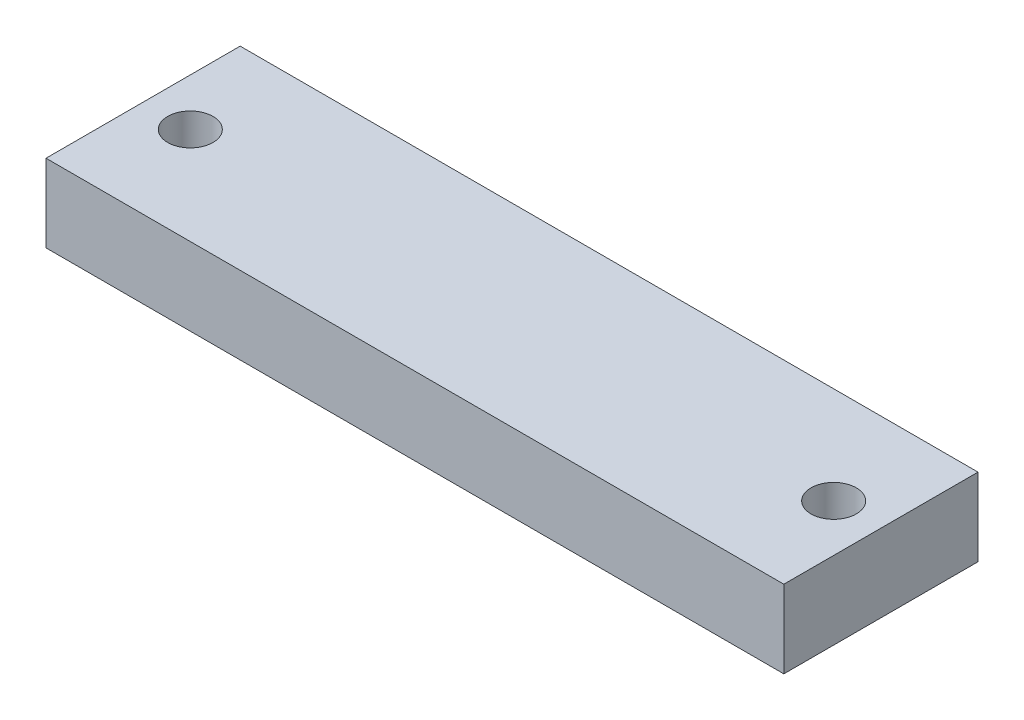
ISO-10303-21;
HEADER;
FILE_DESCRIPTION(('STEP AP214'),'2;1');
FILE_NAME('part.step','',(''),(''),'','','');
FILE_SCHEMA(('AUTOMOTIVE_DESIGN { 1 0 10303 214 1 1 1 1 }'));
ENDSEC;
DATA;
#1=APPLICATION_CONTEXT('core data for automotive mechanical design processes');
#2=APPLICATION_PROTOCOL_DEFINITION('international standard','automotive_design',2000,#1);
#3=PRODUCT_CONTEXT('',#1,'mechanical');
#4=PRODUCT('Part','Part','',(#3));
#5=PRODUCT_RELATED_PRODUCT_CATEGORY('part','',(#4));
#6=PRODUCT_DEFINITION_FORMATION('','',#4);
#7=PRODUCT_DEFINITION_CONTEXT('part definition',#1,'design');
#8=PRODUCT_DEFINITION('design','',#6,#7);
#9=PRODUCT_DEFINITION_SHAPE('','',#8);
#10=(LENGTH_UNIT() NAMED_UNIT(*) SI_UNIT(.MILLI.,.METRE.));
#11=(NAMED_UNIT(*) PLANE_ANGLE_UNIT() SI_UNIT($,.RADIAN.));
#12=(NAMED_UNIT(*) SI_UNIT($,.STERADIAN.) SOLID_ANGLE_UNIT());
#13=UNCERTAINTY_MEASURE_WITH_UNIT(LENGTH_MEASURE(1.E-05),#10,'distance_accuracy_value','');
#14=(GEOMETRIC_REPRESENTATION_CONTEXT(3) GLOBAL_UNCERTAINTY_ASSIGNED_CONTEXT((#13)) GLOBAL_UNIT_ASSIGNED_CONTEXT((#10,
#11,#12)) REPRESENTATION_CONTEXT('',''));
#15=CARTESIAN_POINT('',(0.,0.,0.));
#16=DIRECTION('',(0.,0.,1.));
#17=DIRECTION('',(1.,0.,0.));
#18=AXIS2_PLACEMENT_3D('',#15,#16,#17);
#19=CARTESIAN_POINT('',(0.,6.,0.));
#20=DIRECTION('',(0.,1.,0.));
#21=DIRECTION('',(0.,0.,1.));
#22=AXIS2_PLACEMENT_3D('',#19,#20,#21);
#23=PLANE('',#22);
#24=CARTESIAN_POINT('',(3.65,6.,7.5));
#25=DIRECTION('',(0.,1.,0.));
#26=DIRECTION('',(0.,0.,1.));
#27=AXIS2_PLACEMENT_3D('',#24,#25,#26);
#28=CIRCLE('',#27,1.75);
#29=CARTESIAN_POINT('',(3.65,6.,9.25));
#30=VERTEX_POINT('',#29);
#31=EDGE_CURVE('E119',#30,#30,#28,.T.);
#32=ORIENTED_EDGE('',*,*,#31,.F.);
#33=EDGE_LOOP('',(#32));
#34=FACE_BOUND('',#33,.T.);
#35=DIRECTION('',(0.,0.,1.));
#36=VECTOR('',#35,1.);
#37=CARTESIAN_POINT('',(0.,6.,0.));
#38=LINE('',#37,#36);
#39=CARTESIAN_POINT('',(0.,6.,0.));
#40=VERTEX_POINT('',#39);
#41=CARTESIAN_POINT('',(0.,6.,15.));
#42=VERTEX_POINT('',#41);
#43=EDGE_CURVE('E97',#40,#42,#38,.T.);
#44=ORIENTED_EDGE('',*,*,#43,.T.);
#45=DIRECTION('',(1.,0.,0.));
#46=VECTOR('',#45,1.);
#47=CARTESIAN_POINT('',(0.,6.,15.));
#48=LINE('',#47,#46);
#49=CARTESIAN_POINT('',(57.,6.,15.));
#50=VERTEX_POINT('',#49);
#51=EDGE_CURVE('E93',#42,#50,#48,.T.);
#52=ORIENTED_EDGE('',*,*,#51,.T.);
#53=DIRECTION('',(0.,0.,-1.));
#54=VECTOR('',#53,1.);
#55=CARTESIAN_POINT('',(57.,6.,0.));
#56=LINE('',#55,#54);
#57=CARTESIAN_POINT('',(57.,6.,0.));
#58=VERTEX_POINT('',#57);
#59=EDGE_CURVE('E96',#50,#58,#56,.T.);
#60=ORIENTED_EDGE('',*,*,#59,.T.);
#61=DIRECTION('',(-1.,0.,0.));
#62=VECTOR('',#61,1.);
#63=CARTESIAN_POINT('',(0.,6.,0.));
#64=LINE('',#63,#62);
#65=EDGE_CURVE('E64',#58,#40,#64,.T.);
#66=ORIENTED_EDGE('',*,*,#65,.T.);
#67=EDGE_LOOP('',(#44,#52,#60,#66));
#68=FACE_BOUND('',#67,.T.);
#69=CARTESIAN_POINT('',(53.35,6.,7.5));
#70=DIRECTION('',(0.,1.,0.));
#71=DIRECTION('',(0.,0.,1.));
#72=AXIS2_PLACEMENT_3D('',#69,#70,#71);
#73=CIRCLE('',#72,1.75);
#74=CARTESIAN_POINT('',(53.35,6.,9.25));
#75=VERTEX_POINT('',#74);
#76=EDGE_CURVE('E139',#75,#75,#73,.T.);
#77=ORIENTED_EDGE('',*,*,#76,.F.);
#78=EDGE_LOOP('',(#77));
#79=FACE_BOUND('',#78,.T.);
#80=ADVANCED_FACE('F44',(#34,#68,#79),#23,.T.);
#81=CARTESIAN_POINT('',(0.,0.,0.));
#82=DIRECTION('',(0.,1.,0.));
#83=DIRECTION('',(0.,0.,1.));
#84=AXIS2_PLACEMENT_3D('',#81,#82,#83);
#85=PLANE('',#84);
#86=DIRECTION('',(0.,0.,1.));
#87=VECTOR('',#86,1.);
#88=CARTESIAN_POINT('',(0.,0.,0.));
#89=LINE('',#88,#87);
#90=CARTESIAN_POINT('',(0.,0.,0.));
#91=VERTEX_POINT('',#90);
#92=CARTESIAN_POINT('',(0.,0.,15.));
#93=VERTEX_POINT('',#92);
#94=EDGE_CURVE('E114',#91,#93,#89,.T.);
#95=ORIENTED_EDGE('',*,*,#94,.F.);
#96=DIRECTION('',(-1.,0.,0.));
#97=VECTOR('',#96,1.);
#98=CARTESIAN_POINT('',(0.,0.,0.));
#99=LINE('',#98,#97);
#100=CARTESIAN_POINT('',(57.,0.,0.));
#101=VERTEX_POINT('',#100);
#102=EDGE_CURVE('E86',#101,#91,#99,.T.);
#103=ORIENTED_EDGE('',*,*,#102,.F.);
#104=DIRECTION('',(0.,0.,-1.));
#105=VECTOR('',#104,1.);
#106=CARTESIAN_POINT('',(57.,0.,0.));
#107=LINE('',#106,#105);
#108=CARTESIAN_POINT('',(57.,0.,15.));
#109=VERTEX_POINT('',#108);
#110=EDGE_CURVE('E79',#109,#101,#107,.T.);
#111=ORIENTED_EDGE('',*,*,#110,.F.);
#112=DIRECTION('',(1.,0.,0.));
#113=VECTOR('',#112,1.);
#114=CARTESIAN_POINT('',(0.,0.,15.));
#115=LINE('',#114,#113);
#116=EDGE_CURVE('E104',#93,#109,#115,.T.);
#117=ORIENTED_EDGE('',*,*,#116,.F.);
#118=EDGE_LOOP('',(#95,#103,#111,#117));
#119=FACE_BOUND('',#118,.T.);
#120=CARTESIAN_POINT('',(3.65,0.,7.5));
#121=DIRECTION('',(0.,1.,0.));
#122=DIRECTION('',(0.,0.,1.));
#123=AXIS2_PLACEMENT_3D('',#120,#121,#122);
#124=CIRCLE('',#123,1.75);
#125=CARTESIAN_POINT('',(3.65,0.,9.25));
#126=VERTEX_POINT('',#125);
#127=EDGE_CURVE('E136',#126,#126,#124,.T.);
#128=ORIENTED_EDGE('',*,*,#127,.T.);
#129=EDGE_LOOP('',(#128));
#130=FACE_BOUND('',#129,.T.);
#131=CARTESIAN_POINT('',(53.35,0.,7.5));
#132=DIRECTION('',(0.,1.,0.));
#133=DIRECTION('',(0.,0.,1.));
#134=AXIS2_PLACEMENT_3D('',#131,#132,#133);
#135=CIRCLE('',#134,1.75);
#136=CARTESIAN_POINT('',(53.35,0.,9.25));
#137=VERTEX_POINT('',#136);
#138=EDGE_CURVE('E143',#137,#137,#135,.T.);
#139=ORIENTED_EDGE('',*,*,#138,.T.);
#140=EDGE_LOOP('',(#139));
#141=FACE_BOUND('',#140,.T.);
#142=ADVANCED_FACE('F131',(#119,#130,#141),#85,.F.);
#143=CARTESIAN_POINT('',(0.,6.,0.));
#144=DIRECTION('',(1.,0.,0.));
#145=DIRECTION('',(0.,0.,-1.));
#146=AXIS2_PLACEMENT_3D('',#143,#144,#145);
#147=PLANE('',#146);
#148=ORIENTED_EDGE('',*,*,#94,.T.);
#149=DIRECTION('',(0.,-1.,0.));
#150=VECTOR('',#149,1.);
#151=CARTESIAN_POINT('',(0.,6.,15.));
#152=LINE('',#151,#150);
#153=EDGE_CURVE('E11',#42,#93,#152,.T.);
#154=ORIENTED_EDGE('',*,*,#153,.F.);
#155=ORIENTED_EDGE('',*,*,#43,.F.);
#156=DIRECTION('',(0.,-1.,0.));
#157=VECTOR('',#156,1.);
#158=CARTESIAN_POINT('',(0.,6.,0.));
#159=LINE('',#158,#157);
#160=EDGE_CURVE('E110',#40,#91,#159,.T.);
#161=ORIENTED_EDGE('',*,*,#160,.T.);
#162=EDGE_LOOP('',(#148,#154,#155,#161));
#163=FACE_BOUND('',#162,.T.);
#164=ADVANCED_FACE('F50',(#163),#147,.F.);
#165=CARTESIAN_POINT('',(0.,6.,15.));
#166=DIRECTION('',(0.,0.,-1.));
#167=DIRECTION('',(-1.,0.,0.));
#168=AXIS2_PLACEMENT_3D('',#165,#166,#167);
#169=PLANE('',#168);
#170=ORIENTED_EDGE('',*,*,#116,.T.);
#171=DIRECTION('',(0.,-1.,0.));
#172=VECTOR('',#171,1.);
#173=CARTESIAN_POINT('',(57.,6.,15.));
#174=LINE('',#173,#172);
#175=EDGE_CURVE('E54',#50,#109,#174,.T.);
#176=ORIENTED_EDGE('',*,*,#175,.F.);
#177=ORIENTED_EDGE('',*,*,#51,.F.);
#178=ORIENTED_EDGE('',*,*,#153,.T.);
#179=EDGE_LOOP('',(#170,#176,#177,#178));
#180=FACE_BOUND('',#179,.T.);
#181=ADVANCED_FACE('F105',(#180),#169,.F.);
#182=CARTESIAN_POINT('',(57.,6.,0.));
#183=DIRECTION('',(-1.,0.,0.));
#184=DIRECTION('',(0.,0.,1.));
#185=AXIS2_PLACEMENT_3D('',#182,#183,#184);
#186=PLANE('',#185);
#187=ORIENTED_EDGE('',*,*,#110,.T.);
#188=DIRECTION('',(0.,-1.,0.));
#189=VECTOR('',#188,1.);
#190=CARTESIAN_POINT('',(57.,6.,0.));
#191=LINE('',#190,#189);
#192=EDGE_CURVE('E103',#58,#101,#191,.T.);
#193=ORIENTED_EDGE('',*,*,#192,.F.);
#194=ORIENTED_EDGE('',*,*,#59,.F.);
#195=ORIENTED_EDGE('',*,*,#175,.T.);
#196=EDGE_LOOP('',(#187,#193,#194,#195));
#197=FACE_BOUND('',#196,.T.);
#198=ADVANCED_FACE('F106',(#197),#186,.F.);
#199=CARTESIAN_POINT('',(0.,6.,0.));
#200=DIRECTION('',(0.,0.,1.));
#201=DIRECTION('',(1.,0.,0.));
#202=AXIS2_PLACEMENT_3D('',#199,#200,#201);
#203=PLANE('',#202);
#204=ORIENTED_EDGE('',*,*,#102,.T.);
#205=ORIENTED_EDGE('',*,*,#160,.F.);
#206=ORIENTED_EDGE('',*,*,#65,.F.);
#207=ORIENTED_EDGE('',*,*,#192,.T.);
#208=EDGE_LOOP('',(#204,#205,#206,#207));
#209=FACE_BOUND('',#208,.T.);
#210=ADVANCED_FACE('F126',(#209),#203,.F.);
#211=CARTESIAN_POINT('',(3.65,6.,7.5));
#212=DIRECTION('',(0.,-1.,0.));
#213=DIRECTION('',(0.,0.,-1.));
#214=AXIS2_PLACEMENT_3D('',#211,#212,#213);
#215=CYLINDRICAL_SURFACE('',#214,1.75);
#216=ORIENTED_EDGE('',*,*,#31,.T.);
#217=EDGE_LOOP('',(#216));
#218=FACE_BOUND('',#217,.T.);
#219=ORIENTED_EDGE('',*,*,#127,.F.);
#220=EDGE_LOOP('',(#219));
#221=FACE_BOUND('',#220,.T.);
#222=ADVANCED_FACE('F164',(#218,#221),#215,.F.);
#223=CARTESIAN_POINT('',(53.35,6.,7.5));
#224=DIRECTION('',(0.,-1.,0.));
#225=DIRECTION('',(0.,0.,-1.));
#226=AXIS2_PLACEMENT_3D('',#223,#224,#225);
#227=CYLINDRICAL_SURFACE('',#226,1.75);
#228=ORIENTED_EDGE('',*,*,#76,.T.);
#229=EDGE_LOOP('',(#228));
#230=FACE_BOUND('',#229,.T.);
#231=ORIENTED_EDGE('',*,*,#138,.F.);
#232=EDGE_LOOP('',(#231));
#233=FACE_BOUND('',#232,.T.);
#234=ADVANCED_FACE('F152',(#230,#233),#227,.F.);
#235=CLOSED_SHELL('',(#80,#142,#164,#181,#198,#210,#222,#234));
#236=MANIFOLD_SOLID_BREP('B2',#235);
#237=ADVANCED_BREP_SHAPE_REPRESENTATION('',(#18,#236),#14);
#238=SHAPE_DEFINITION_REPRESENTATION(#9,#237);
ENDSEC;
END-ISO-10303-21;
